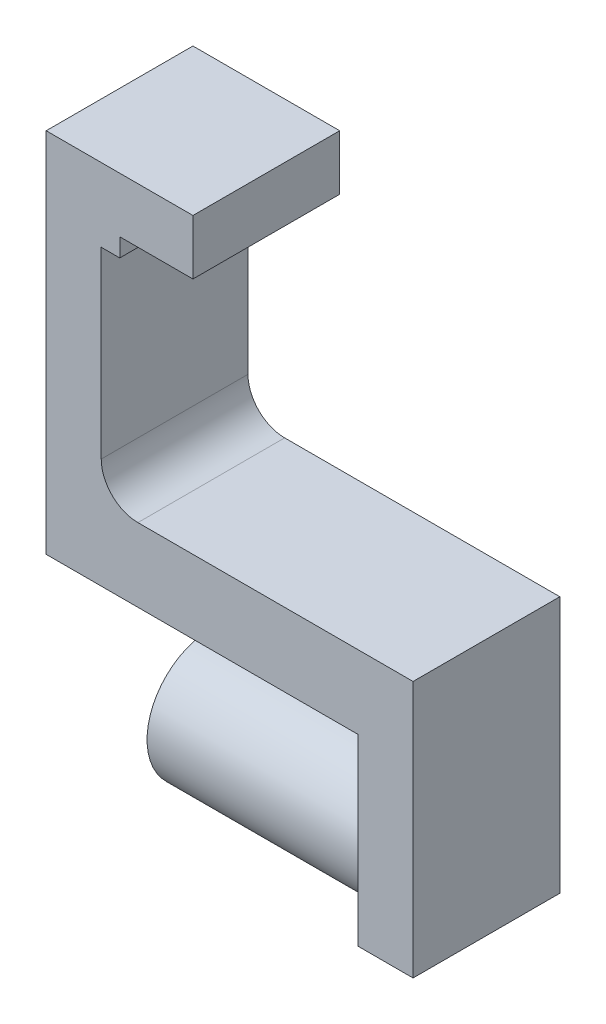
ISO-10303-21;
HEADER;
FILE_DESCRIPTION(('STEP AP214'),'2;1');
FILE_NAME('part.step','',(''),(''),'','','');
FILE_SCHEMA(('AUTOMOTIVE_DESIGN { 1 0 10303 214 1 1 1 1 }'));
ENDSEC;
DATA;
#1=APPLICATION_CONTEXT('core data for automotive mechanical design processes');
#2=APPLICATION_PROTOCOL_DEFINITION('international standard','automotive_design',2000,#1);
#3=PRODUCT_CONTEXT('',#1,'mechanical');
#4=PRODUCT('Part','Part','',(#3));
#5=PRODUCT_RELATED_PRODUCT_CATEGORY('part','',(#4));
#6=PRODUCT_DEFINITION_FORMATION('','',#4);
#7=PRODUCT_DEFINITION_CONTEXT('part definition',#1,'design');
#8=PRODUCT_DEFINITION('design','',#6,#7);
#9=PRODUCT_DEFINITION_SHAPE('','',#8);
#10=(LENGTH_UNIT() NAMED_UNIT(*) SI_UNIT(.MILLI.,.METRE.));
#11=(NAMED_UNIT(*) PLANE_ANGLE_UNIT() SI_UNIT($,.RADIAN.));
#12=(NAMED_UNIT(*) SI_UNIT($,.STERADIAN.) SOLID_ANGLE_UNIT());
#13=UNCERTAINTY_MEASURE_WITH_UNIT(LENGTH_MEASURE(1.E-05),#10,'distance_accuracy_value','');
#14=(GEOMETRIC_REPRESENTATION_CONTEXT(3) GLOBAL_UNCERTAINTY_ASSIGNED_CONTEXT((#13)) GLOBAL_UNIT_ASSIGNED_CONTEXT((#10,
#11,#12)) REPRESENTATION_CONTEXT('',''));
#15=CARTESIAN_POINT('',(0.,0.,0.));
#16=DIRECTION('',(0.,0.,1.));
#17=DIRECTION('',(1.,0.,0.));
#18=AXIS2_PLACEMENT_3D('',#15,#16,#17);
#19=CARTESIAN_POINT('',(-38.1,0.,0.));
#20=DIRECTION('',(1.,0.,0.));
#21=DIRECTION('',(0.,0.,-1.));
#22=AXIS2_PLACEMENT_3D('',#19,#20,#21);
#23=CYLINDRICAL_SURFACE('',#22,11.1125);
#24=CARTESIAN_POINT('',(-38.1,0.,0.));
#25=DIRECTION('',(1.,0.,0.));
#26=DIRECTION('',(0.,0.,-1.));
#27=AXIS2_PLACEMENT_3D('',#24,#25,#26);
#28=CIRCLE('',#27,11.1125);
#29=CARTESIAN_POINT('',(-38.1,0.,-11.1125));
#30=VERTEX_POINT('',#29);
#31=EDGE_CURVE('E250',#30,#30,#28,.T.);
#32=ORIENTED_EDGE('',*,*,#31,.T.);
#33=EDGE_LOOP('',(#32));
#34=FACE_BOUND('',#33,.T.);
#35=CARTESIAN_POINT('',(0.,0.,0.));
#36=DIRECTION('',(1.,0.,0.));
#37=DIRECTION('',(0.,0.,-1.));
#38=AXIS2_PLACEMENT_3D('',#35,#36,#37);
#39=CIRCLE('',#38,11.1125);
#40=CARTESIAN_POINT('',(0.,-11.1125,0.));
#41=VERTEX_POINT('',#40);
#42=EDGE_CURVE('E241',#41,#41,#39,.T.);
#43=ORIENTED_EDGE('',*,*,#42,.F.);
#44=EDGE_LOOP('',(#43));
#45=FACE_BOUND('',#44,.T.);
#46=ADVANCED_FACE('F50',(#34,#45),#23,.T.);
#47=CARTESIAN_POINT('',(-38.1,0.,0.));
#48=DIRECTION('',(1.,0.,0.));
#49=DIRECTION('',(0.,0.,-1.));
#50=AXIS2_PLACEMENT_3D('',#47,#48,#49);
#51=PLANE('',#50);
#52=ORIENTED_EDGE('',*,*,#31,.F.);
#53=EDGE_LOOP('',(#52));
#54=FACE_BOUND('',#53,.T.);
#55=ADVANCED_FACE('F295',(#54),#51,.F.);
#56=CARTESIAN_POINT('',(0.,-11.1125,-12.7));
#57=DIRECTION('',(-1.,0.,0.));
#58=DIRECTION('',(0.,0.,1.));
#59=AXIS2_PLACEMENT_3D('',#56,#57,#58);
#60=PLANE('',#59);
#61=DIRECTION('',(0.,0.,1.));
#62=VECTOR('',#61,1.);
#63=CARTESIAN_POINT('',(0.,-11.1125,-12.7));
#64=LINE('',#63,#62);
#65=CARTESIAN_POINT('',(0.,-11.1125,-12.7));
#66=VERTEX_POINT('',#65);
#67=EDGE_CURVE('E242',#66,#41,#64,.T.);
#68=ORIENTED_EDGE('',*,*,#67,.T.);
#69=ORIENTED_EDGE('',*,*,#42,.T.);
#70=CARTESIAN_POINT('',(0.,-11.1125,12.7));
#71=VERTEX_POINT('',#70);
#72=EDGE_CURVE('E240',#41,#71,#64,.T.);
#73=ORIENTED_EDGE('',*,*,#72,.T.);
#74=DIRECTION('',(0.,-1.,0.));
#75=VECTOR('',#74,1.);
#76=CARTESIAN_POINT('',(0.,-11.1125,12.7));
#77=LINE('',#76,#75);
#78=CARTESIAN_POINT('',(0.,20.6375,12.7));
#79=VERTEX_POINT('',#78);
#80=EDGE_CURVE('E216',#79,#71,#77,.T.);
#81=ORIENTED_EDGE('',*,*,#80,.F.);
#82=DIRECTION('',(0.,0.,1.));
#83=VECTOR('',#82,1.);
#84=CARTESIAN_POINT('',(0.,20.6375,-12.7));
#85=LINE('',#84,#83);
#86=CARTESIAN_POINT('',(0.,20.6375,-12.7));
#87=VERTEX_POINT('',#86);
#88=EDGE_CURVE('E238',#87,#79,#85,.T.);
#89=ORIENTED_EDGE('',*,*,#88,.F.);
#90=DIRECTION('',(0.,-1.,0.));
#91=VECTOR('',#90,1.);
#92=CARTESIAN_POINT('',(0.,-11.1125,-12.7));
#93=LINE('',#92,#91);
#94=EDGE_CURVE('E230',#87,#66,#93,.T.);
#95=ORIENTED_EDGE('',*,*,#94,.T.);
#96=EDGE_LOOP('',(#68,#69,#73,#81,#89,#95));
#97=FACE_BOUND('',#96,.T.);
#98=ADVANCED_FACE('F283',(#97),#60,.T.);
#99=CARTESIAN_POINT('',(9.525,-11.1125,-12.7));
#100=DIRECTION('',(1.,0.,0.));
#101=DIRECTION('',(0.,0.,-1.));
#102=AXIS2_PLACEMENT_3D('',#99,#100,#101);
#103=PLANE('',#102);
#104=DIRECTION('',(0.,1.,0.));
#105=VECTOR('',#104,1.);
#106=CARTESIAN_POINT('',(9.525,-11.1125,-12.7));
#107=LINE('',#106,#105);
#108=CARTESIAN_POINT('',(9.525,-11.1125,-12.7));
#109=VERTEX_POINT('',#108);
#110=CARTESIAN_POINT('',(9.52500000000001,33.3375,-12.7));
#111=VERTEX_POINT('',#110);
#112=EDGE_CURVE('E232',#109,#111,#107,.T.);
#113=ORIENTED_EDGE('',*,*,#112,.T.);
#114=DIRECTION('',(0.,0.,1.));
#115=VECTOR('',#114,1.);
#116=CARTESIAN_POINT('',(9.52500000000001,33.3375,-12.7));
#117=LINE('',#116,#115);
#118=CARTESIAN_POINT('',(9.52500000000001,33.3375,12.7));
#119=VERTEX_POINT('',#118);
#120=EDGE_CURVE('E217',#111,#119,#117,.T.);
#121=ORIENTED_EDGE('',*,*,#120,.T.);
#122=DIRECTION('',(0.,1.,0.));
#123=VECTOR('',#122,1.);
#124=CARTESIAN_POINT('',(9.525,-11.1125,12.7));
#125=LINE('',#124,#123);
#126=CARTESIAN_POINT('',(9.525,-11.1125,12.7));
#127=VERTEX_POINT('',#126);
#128=EDGE_CURVE('E227',#127,#119,#125,.T.);
#129=ORIENTED_EDGE('',*,*,#128,.F.);
#130=DIRECTION('',(0.,0.,1.));
#131=VECTOR('',#130,1.);
#132=CARTESIAN_POINT('',(9.525,-11.1125,-12.7));
#133=LINE('',#132,#131);
#134=EDGE_CURVE('E245',#109,#127,#133,.T.);
#135=ORIENTED_EDGE('',*,*,#134,.F.);
#136=EDGE_LOOP('',(#113,#121,#129,#135));
#137=FACE_BOUND('',#136,.T.);
#138=ADVANCED_FACE('F304',(#137),#103,.T.);
#139=CARTESIAN_POINT('',(0.,-11.1125,-12.7));
#140=DIRECTION('',(0.,-1.,0.));
#141=DIRECTION('',(0.,0.,-1.));
#142=AXIS2_PLACEMENT_3D('',#139,#140,#141);
#143=PLANE('',#142);
#144=ORIENTED_EDGE('',*,*,#134,.T.);
#145=DIRECTION('',(1.,0.,0.));
#146=VECTOR('',#145,1.);
#147=CARTESIAN_POINT('',(0.,-11.1125,12.7));
#148=LINE('',#147,#146);
#149=EDGE_CURVE('E224',#71,#127,#148,.T.);
#150=ORIENTED_EDGE('',*,*,#149,.F.);
#151=ORIENTED_EDGE('',*,*,#72,.F.);
#152=ORIENTED_EDGE('',*,*,#67,.F.);
#153=DIRECTION('',(1.,0.,0.));
#154=VECTOR('',#153,1.);
#155=CARTESIAN_POINT('',(0.,-11.1125,-12.7));
#156=LINE('',#155,#154);
#157=EDGE_CURVE('E235',#66,#109,#156,.T.);
#158=ORIENTED_EDGE('',*,*,#157,.T.);
#159=EDGE_LOOP('',(#144,#150,#151,#152,#158));
#160=FACE_BOUND('',#159,.T.);
#161=ADVANCED_FACE('F289',(#160),#143,.T.);
#162=CARTESIAN_POINT('',(0.,0.,-12.7));
#163=DIRECTION('',(0.,0.,-1.));
#164=DIRECTION('',(-1.,0.,0.));
#165=AXIS2_PLACEMENT_3D('',#162,#163,#164);
#166=PLANE('',#165);
#167=DIRECTION('',(-1.,0.,0.));
#168=VECTOR('',#167,1.);
#169=CARTESIAN_POINT('',(-53.975,84.1375,-12.7));
#170=LINE('',#169,#168);
#171=CARTESIAN_POINT('',(-28.575,84.1375,-12.7));
#172=VERTEX_POINT('',#171);
#173=CARTESIAN_POINT('',(-53.975,84.1375,-12.7));
#174=VERTEX_POINT('',#173);
#175=EDGE_CURVE('E200',#172,#174,#170,.T.);
#176=ORIENTED_EDGE('',*,*,#175,.F.);
#177=DIRECTION('',(0.,1.,0.));
#178=VECTOR('',#177,1.);
#179=CARTESIAN_POINT('',(-28.575,74.6125,-12.7));
#180=LINE('',#179,#178);
#181=CARTESIAN_POINT('',(-28.575,74.6125,-12.7));
#182=VERTEX_POINT('',#181);
#183=EDGE_CURVE('E170',#182,#172,#180,.T.);
#184=ORIENTED_EDGE('',*,*,#183,.F.);
#185=DIRECTION('',(1.,0.,0.));
#186=VECTOR('',#185,1.);
#187=CARTESIAN_POINT('',(-41.23944,74.6125,-12.7));
#188=LINE('',#187,#186);
#189=CARTESIAN_POINT('',(-41.23944,74.6125,-12.7));
#190=VERTEX_POINT('',#189);
#191=EDGE_CURVE('E179',#190,#182,#188,.T.);
#192=ORIENTED_EDGE('',*,*,#191,.F.);
#193=DIRECTION('',(0.,1.,0.));
#194=VECTOR('',#193,1.);
#195=CARTESIAN_POINT('',(-41.23944,71.4375,-12.7));
#196=LINE('',#195,#194);
#197=CARTESIAN_POINT('',(-41.23944,71.4375,-12.7));
#198=VERTEX_POINT('',#197);
#199=EDGE_CURVE('E178',#198,#190,#196,.T.);
#200=ORIENTED_EDGE('',*,*,#199,.F.);
#201=DIRECTION('',(1.,0.,0.));
#202=VECTOR('',#201,1.);
#203=CARTESIAN_POINT('',(-53.975,71.4375,-12.7));
#204=LINE('',#203,#202);
#205=CARTESIAN_POINT('',(-44.45,71.4375,-12.7));
#206=VERTEX_POINT('',#205);
#207=EDGE_CURVE('E162',#206,#198,#204,.T.);
#208=ORIENTED_EDGE('',*,*,#207,.F.);
#209=DIRECTION('',(0.,1.,0.));
#210=VECTOR('',#209,1.);
#211=CARTESIAN_POINT('',(-44.45,20.6375,-12.7));
#212=LINE('',#211,#210);
#213=CARTESIAN_POINT('',(-44.45,39.6875,-12.7));
#214=VERTEX_POINT('',#213);
#215=EDGE_CURVE('E193',#214,#206,#212,.T.);
#216=ORIENTED_EDGE('',*,*,#215,.F.);
#217=CARTESIAN_POINT('',(-38.1,39.6875,-12.7));
#218=DIRECTION('',(0.,0.,-1.));
#219=DIRECTION('',(-1.,0.,0.));
#220=AXIS2_PLACEMENT_3D('',#217,#218,#219);
#221=CIRCLE('',#220,6.35);
#222=CARTESIAN_POINT('',(-38.1,33.3375,-12.7));
#223=VERTEX_POINT('',#222);
#224=EDGE_CURVE('E54',#214,#223,#221,.F.);
#225=ORIENTED_EDGE('',*,*,#224,.T.);
#226=DIRECTION('',(-1.,0.,0.));
#227=VECTOR('',#226,1.);
#228=CARTESIAN_POINT('',(-53.975,33.3375,-12.7));
#229=LINE('',#228,#227);
#230=EDGE_CURVE('E214',#111,#223,#229,.T.);
#231=ORIENTED_EDGE('',*,*,#230,.F.);
#232=ORIENTED_EDGE('',*,*,#112,.F.);
#233=ORIENTED_EDGE('',*,*,#157,.F.);
#234=ORIENTED_EDGE('',*,*,#94,.F.);
#235=DIRECTION('',(1.,0.,0.));
#236=VECTOR('',#235,1.);
#237=CARTESIAN_POINT('',(-53.975,20.6375,-12.7));
#238=LINE('',#237,#236);
#239=CARTESIAN_POINT('',(-53.975,20.6375,-12.7));
#240=VERTEX_POINT('',#239);
#241=EDGE_CURVE('E212',#240,#87,#238,.T.);
#242=ORIENTED_EDGE('',*,*,#241,.F.);
#243=DIRECTION('',(0.,-1.,0.));
#244=VECTOR('',#243,1.);
#245=CARTESIAN_POINT('',(-53.975,20.6375,-12.7));
#246=LINE('',#245,#244);
#247=EDGE_CURVE('E209',#174,#240,#246,.T.);
#248=ORIENTED_EDGE('',*,*,#247,.F.);
#249=EDGE_LOOP('',(#176,#184,#192,#200,#208,#216,#225,#231,#232,#233,#234,#242,#248));
#250=FACE_BOUND('',#249,.T.);
#251=ADVANCED_FACE('F265',(#250),#166,.T.);
#252=CARTESIAN_POINT('',(0.,0.,12.7));
#253=DIRECTION('',(0.,0.,-1.));
#254=DIRECTION('',(-1.,0.,0.));
#255=AXIS2_PLACEMENT_3D('',#252,#253,#254);
#256=PLANE('',#255);
#257=DIRECTION('',(0.,-1.,0.));
#258=VECTOR('',#257,1.);
#259=CARTESIAN_POINT('',(-53.975,20.6375,12.7));
#260=LINE('',#259,#258);
#261=CARTESIAN_POINT('',(-53.975,84.1375,12.7));
#262=VERTEX_POINT('',#261);
#263=CARTESIAN_POINT('',(-53.975,20.6375,12.7));
#264=VERTEX_POINT('',#263);
#265=EDGE_CURVE('E203',#262,#264,#260,.T.);
#266=ORIENTED_EDGE('',*,*,#265,.T.);
#267=DIRECTION('',(1.,0.,0.));
#268=VECTOR('',#267,1.);
#269=CARTESIAN_POINT('',(-53.975,20.6375,12.7));
#270=LINE('',#269,#268);
#271=EDGE_CURVE('E201',#264,#79,#270,.T.);
#272=ORIENTED_EDGE('',*,*,#271,.T.);
#273=ORIENTED_EDGE('',*,*,#80,.T.);
#274=ORIENTED_EDGE('',*,*,#149,.T.);
#275=ORIENTED_EDGE('',*,*,#128,.T.);
#276=DIRECTION('',(-1.,0.,0.));
#277=VECTOR('',#276,1.);
#278=CARTESIAN_POINT('',(-53.975,33.3375,12.7));
#279=LINE('',#278,#277);
#280=CARTESIAN_POINT('',(-38.1,33.3375,12.7));
#281=VERTEX_POINT('',#280);
#282=EDGE_CURVE('E210',#119,#281,#279,.T.);
#283=ORIENTED_EDGE('',*,*,#282,.T.);
#284=CARTESIAN_POINT('',(-38.1,39.6875,12.7));
#285=DIRECTION('',(0.,0.,-1.));
#286=DIRECTION('',(-1.,0.,0.));
#287=AXIS2_PLACEMENT_3D('',#284,#285,#286);
#288=CIRCLE('',#287,6.35);
#289=CARTESIAN_POINT('',(-44.45,39.6875,12.7));
#290=VERTEX_POINT('',#289);
#291=EDGE_CURVE('E11',#281,#290,#288,.T.);
#292=ORIENTED_EDGE('',*,*,#291,.T.);
#293=DIRECTION('',(0.,1.,0.));
#294=VECTOR('',#293,1.);
#295=CARTESIAN_POINT('',(-44.45,20.6375,12.7));
#296=LINE('',#295,#294);
#297=CARTESIAN_POINT('',(-44.45,71.4375,12.7));
#298=VERTEX_POINT('',#297);
#299=EDGE_CURVE('E154',#290,#298,#296,.T.);
#300=ORIENTED_EDGE('',*,*,#299,.T.);
#301=DIRECTION('',(1.,0.,0.));
#302=VECTOR('',#301,1.);
#303=CARTESIAN_POINT('',(-53.975,71.4375,12.7));
#304=LINE('',#303,#302);
#305=CARTESIAN_POINT('',(-41.23944,71.4375,12.7));
#306=VERTEX_POINT('',#305);
#307=EDGE_CURVE('E143',#298,#306,#304,.T.);
#308=ORIENTED_EDGE('',*,*,#307,.T.);
#309=DIRECTION('',(0.,1.,0.));
#310=VECTOR('',#309,1.);
#311=CARTESIAN_POINT('',(-41.23944,71.4375,12.7));
#312=LINE('',#311,#310);
#313=CARTESIAN_POINT('',(-41.23944,74.6125,12.7));
#314=VERTEX_POINT('',#313);
#315=EDGE_CURVE('E148',#306,#314,#312,.T.);
#316=ORIENTED_EDGE('',*,*,#315,.T.);
#317=DIRECTION('',(1.,0.,0.));
#318=VECTOR('',#317,1.);
#319=CARTESIAN_POINT('',(-41.23944,74.6125,12.7));
#320=LINE('',#319,#318);
#321=CARTESIAN_POINT('',(-28.575,74.6125,12.7));
#322=VERTEX_POINT('',#321);
#323=EDGE_CURVE('E167',#314,#322,#320,.T.);
#324=ORIENTED_EDGE('',*,*,#323,.T.);
#325=DIRECTION('',(0.,1.,0.));
#326=VECTOR('',#325,1.);
#327=CARTESIAN_POINT('',(-28.575,74.6125,12.7));
#328=LINE('',#327,#326);
#329=CARTESIAN_POINT('',(-28.575,84.1375,12.7));
#330=VERTEX_POINT('',#329);
#331=EDGE_CURVE('E175',#322,#330,#328,.T.);
#332=ORIENTED_EDGE('',*,*,#331,.T.);
#333=DIRECTION('',(-1.,0.,0.));
#334=VECTOR('',#333,1.);
#335=CARTESIAN_POINT('',(-53.975,84.1375,12.7));
#336=LINE('',#335,#334);
#337=EDGE_CURVE('E195',#330,#262,#336,.T.);
#338=ORIENTED_EDGE('',*,*,#337,.T.);
#339=EDGE_LOOP('',(#266,#272,#273,#274,#275,#283,#292,#300,#308,#316,#324,#332,#338));
#340=FACE_BOUND('',#339,.T.);
#341=ADVANCED_FACE('F150',(#340),#256,.F.);
#342=CARTESIAN_POINT('',(-53.975,20.6375,-12.7));
#343=DIRECTION('',(-1.,0.,0.));
#344=DIRECTION('',(0.,0.,1.));
#345=AXIS2_PLACEMENT_3D('',#342,#343,#344);
#346=PLANE('',#345);
#347=DIRECTION('',(0.,0.,1.));
#348=VECTOR('',#347,1.);
#349=CARTESIAN_POINT('',(-53.975,20.6375,-12.7));
#350=LINE('',#349,#348);
#351=EDGE_CURVE('E213',#240,#264,#350,.T.);
#352=ORIENTED_EDGE('',*,*,#351,.T.);
#353=ORIENTED_EDGE('',*,*,#265,.F.);
#354=DIRECTION('',(0.,0.,1.));
#355=VECTOR('',#354,1.);
#356=CARTESIAN_POINT('',(-53.975,84.1375,-12.7));
#357=LINE('',#356,#355);
#358=EDGE_CURVE('E198',#174,#262,#357,.T.);
#359=ORIENTED_EDGE('',*,*,#358,.F.);
#360=ORIENTED_EDGE('',*,*,#247,.T.);
#361=EDGE_LOOP('',(#352,#353,#359,#360));
#362=FACE_BOUND('',#361,.T.);
#363=ADVANCED_FACE('F279',(#362),#346,.T.);
#364=CARTESIAN_POINT('',(-53.975,33.3375,-12.7));
#365=DIRECTION('',(0.,1.,0.));
#366=DIRECTION('',(0.,0.,1.));
#367=AXIS2_PLACEMENT_3D('',#364,#365,#366);
#368=PLANE('',#367);
#369=ORIENTED_EDGE('',*,*,#230,.T.);
#370=DIRECTION('',(0.,0.,-1.));
#371=VECTOR('',#370,1.);
#372=CARTESIAN_POINT('',(-38.1,33.3375,12.7));
#373=LINE('',#372,#371);
#374=EDGE_CURVE('E69',#223,#281,#373,.F.);
#375=ORIENTED_EDGE('',*,*,#374,.T.);
#376=ORIENTED_EDGE('',*,*,#282,.F.);
#377=ORIENTED_EDGE('',*,*,#120,.F.);
#378=EDGE_LOOP('',(#369,#375,#376,#377));
#379=FACE_BOUND('',#378,.T.);
#380=ADVANCED_FACE('F317',(#379),#368,.T.);
#381=CARTESIAN_POINT('',(-53.975,20.6375,-12.7));
#382=DIRECTION('',(0.,-1.,0.));
#383=DIRECTION('',(0.,0.,-1.));
#384=AXIS2_PLACEMENT_3D('',#381,#382,#383);
#385=PLANE('',#384);
#386=ORIENTED_EDGE('',*,*,#88,.T.);
#387=ORIENTED_EDGE('',*,*,#271,.F.);
#388=ORIENTED_EDGE('',*,*,#351,.F.);
#389=ORIENTED_EDGE('',*,*,#241,.T.);
#390=EDGE_LOOP('',(#386,#387,#388,#389));
#391=FACE_BOUND('',#390,.T.);
#392=ADVANCED_FACE('F282',(#391),#385,.T.);
#393=CARTESIAN_POINT('',(-53.975,84.1375,-12.7));
#394=DIRECTION('',(0.,1.,0.));
#395=DIRECTION('',(0.,0.,1.));
#396=AXIS2_PLACEMENT_3D('',#393,#394,#395);
#397=PLANE('',#396);
#398=ORIENTED_EDGE('',*,*,#358,.T.);
#399=ORIENTED_EDGE('',*,*,#337,.F.);
#400=DIRECTION('',(0.,0.,1.));
#401=VECTOR('',#400,1.);
#402=CARTESIAN_POINT('',(-28.575,84.1375,-12.7));
#403=LINE('',#402,#401);
#404=EDGE_CURVE('E184',#172,#330,#403,.T.);
#405=ORIENTED_EDGE('',*,*,#404,.F.);
#406=ORIENTED_EDGE('',*,*,#175,.T.);
#407=EDGE_LOOP('',(#398,#399,#405,#406));
#408=FACE_BOUND('',#407,.T.);
#409=ADVANCED_FACE('F275',(#408),#397,.T.);
#410=CARTESIAN_POINT('',(-44.45,20.6375,-12.7));
#411=DIRECTION('',(1.,0.,0.));
#412=DIRECTION('',(0.,0.,-1.));
#413=AXIS2_PLACEMENT_3D('',#410,#411,#412);
#414=PLANE('',#413);
#415=ORIENTED_EDGE('',*,*,#299,.F.);
#416=DIRECTION('',(0.,0.,-1.));
#417=VECTOR('',#416,1.);
#418=CARTESIAN_POINT('',(-44.45,39.6875,-12.7));
#419=LINE('',#418,#417);
#420=EDGE_CURVE('E251',#290,#214,#419,.T.);
#421=ORIENTED_EDGE('',*,*,#420,.T.);
#422=ORIENTED_EDGE('',*,*,#215,.T.);
#423=DIRECTION('',(0.,0.,-1.));
#424=VECTOR('',#423,1.);
#425=CARTESIAN_POINT('',(-44.45,71.4375,-12.7));
#426=LINE('',#425,#424);
#427=EDGE_CURVE('E249',#298,#206,#426,.T.);
#428=ORIENTED_EDGE('',*,*,#427,.F.);
#429=EDGE_LOOP('',(#415,#421,#422,#428));
#430=FACE_BOUND('',#429,.T.);
#431=ADVANCED_FACE('F256',(#430),#414,.T.);
#432=CARTESIAN_POINT('',(-28.575,74.6125,-12.7));
#433=DIRECTION('',(1.,0.,0.));
#434=DIRECTION('',(0.,0.,-1.));
#435=AXIS2_PLACEMENT_3D('',#432,#433,#434);
#436=PLANE('',#435);
#437=ORIENTED_EDGE('',*,*,#404,.T.);
#438=ORIENTED_EDGE('',*,*,#331,.F.);
#439=DIRECTION('',(0.,0.,1.));
#440=VECTOR('',#439,1.);
#441=CARTESIAN_POINT('',(-28.575,74.6125,-12.7));
#442=LINE('',#441,#440);
#443=EDGE_CURVE('E189',#182,#322,#442,.T.);
#444=ORIENTED_EDGE('',*,*,#443,.F.);
#445=ORIENTED_EDGE('',*,*,#183,.T.);
#446=EDGE_LOOP('',(#437,#438,#444,#445));
#447=FACE_BOUND('',#446,.T.);
#448=ADVANCED_FACE('F269',(#447),#436,.T.);
#449=CARTESIAN_POINT('',(-41.23944,74.6125,-12.7));
#450=DIRECTION('',(0.,-1.,0.));
#451=DIRECTION('',(0.,0.,-1.));
#452=AXIS2_PLACEMENT_3D('',#449,#450,#451);
#453=PLANE('',#452);
#454=ORIENTED_EDGE('',*,*,#443,.T.);
#455=ORIENTED_EDGE('',*,*,#323,.F.);
#456=DIRECTION('',(0.,0.,1.));
#457=VECTOR('',#456,1.);
#458=CARTESIAN_POINT('',(-41.23944,74.6125,-12.7));
#459=LINE('',#458,#457);
#460=EDGE_CURVE('E168',#190,#314,#459,.T.);
#461=ORIENTED_EDGE('',*,*,#460,.F.);
#462=ORIENTED_EDGE('',*,*,#191,.T.);
#463=EDGE_LOOP('',(#454,#455,#461,#462));
#464=FACE_BOUND('',#463,.T.);
#465=ADVANCED_FACE('F267',(#464),#453,.T.);
#466=CARTESIAN_POINT('',(-41.23944,71.4375,-12.7));
#467=DIRECTION('',(1.,0.,0.));
#468=DIRECTION('',(0.,0.,-1.));
#469=AXIS2_PLACEMENT_3D('',#466,#467,#468);
#470=PLANE('',#469);
#471=ORIENTED_EDGE('',*,*,#460,.T.);
#472=ORIENTED_EDGE('',*,*,#315,.F.);
#473=DIRECTION('',(0.,0.,1.));
#474=VECTOR('',#473,1.);
#475=CARTESIAN_POINT('',(-41.23944,71.4375,-12.7));
#476=LINE('',#475,#474);
#477=EDGE_CURVE('E159',#198,#306,#476,.T.);
#478=ORIENTED_EDGE('',*,*,#477,.F.);
#479=ORIENTED_EDGE('',*,*,#199,.T.);
#480=EDGE_LOOP('',(#471,#472,#478,#479));
#481=FACE_BOUND('',#480,.T.);
#482=ADVANCED_FACE('F169',(#481),#470,.T.);
#483=CARTESIAN_POINT('',(-53.975,71.4375,-12.7));
#484=DIRECTION('',(0.,-1.,0.));
#485=DIRECTION('',(0.,0.,-1.));
#486=AXIS2_PLACEMENT_3D('',#483,#484,#485);
#487=PLANE('',#486);
#488=ORIENTED_EDGE('',*,*,#307,.F.);
#489=ORIENTED_EDGE('',*,*,#427,.T.);
#490=ORIENTED_EDGE('',*,*,#207,.T.);
#491=ORIENTED_EDGE('',*,*,#477,.T.);
#492=EDGE_LOOP('',(#488,#489,#490,#491));
#493=FACE_BOUND('',#492,.T.);
#494=ADVANCED_FACE('F156',(#493),#487,.T.);
#495=CARTESIAN_POINT('',(-38.1,39.6875,-12.7));
#496=DIRECTION('',(0.,0.,1.));
#497=DIRECTION('',(1.,0.,0.));
#498=AXIS2_PLACEMENT_3D('',#495,#496,#497);
#499=CYLINDRICAL_SURFACE('',#498,6.35);
#500=ORIENTED_EDGE('',*,*,#291,.F.);
#501=ORIENTED_EDGE('',*,*,#374,.F.);
#502=ORIENTED_EDGE('',*,*,#224,.F.);
#503=ORIENTED_EDGE('',*,*,#420,.F.);
#504=EDGE_LOOP('',(#500,#501,#502,#503));
#505=FACE_BOUND('',#504,.T.);
#506=ADVANCED_FACE('F47',(#505),#499,.F.);
#507=CLOSED_SHELL('',(#46,#55,#98,#138,#161,#251,#341,#363,#380,#392,#409,#431,#448,#465,#482,
#494,#506));
#508=MANIFOLD_SOLID_BREP('B2',#507);
#509=ADVANCED_BREP_SHAPE_REPRESENTATION('',(#18,#508),#14);
#510=SHAPE_DEFINITION_REPRESENTATION(#9,#509);
ENDSEC;
END-ISO-10303-21;
